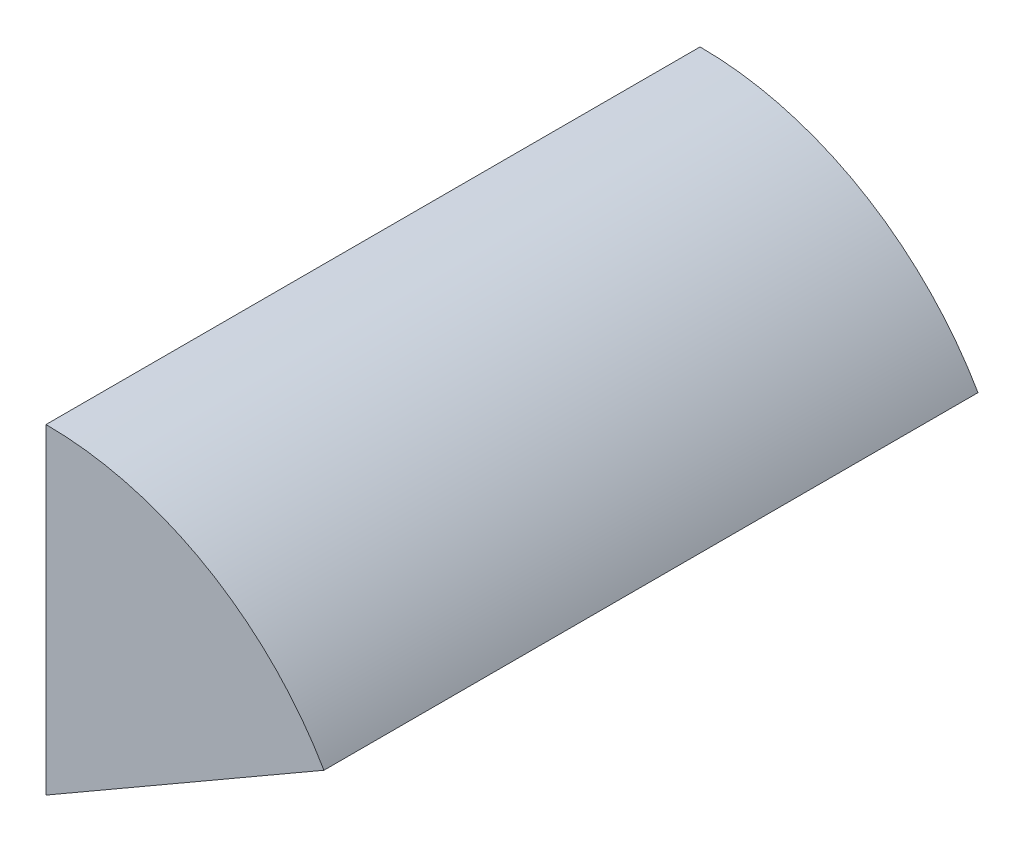
ISO-10303-21;
HEADER;
FILE_DESCRIPTION(('STEP AP214'),'2;1');
FILE_NAME('part.step','',(''),(''),'','','');
FILE_SCHEMA(('AUTOMOTIVE_DESIGN { 1 0 10303 214 1 1 1 1 }'));
ENDSEC;
DATA;
#1=APPLICATION_CONTEXT('core data for automotive mechanical design processes');
#2=APPLICATION_PROTOCOL_DEFINITION('international standard','automotive_design',2000,#1);
#3=PRODUCT_CONTEXT('',#1,'mechanical');
#4=PRODUCT('Part','Part','',(#3));
#5=PRODUCT_RELATED_PRODUCT_CATEGORY('part','',(#4));
#6=PRODUCT_DEFINITION_FORMATION('','',#4);
#7=PRODUCT_DEFINITION_CONTEXT('part definition',#1,'design');
#8=PRODUCT_DEFINITION('design','',#6,#7);
#9=PRODUCT_DEFINITION_SHAPE('','',#8);
#10=(LENGTH_UNIT() NAMED_UNIT(*) SI_UNIT(.MILLI.,.METRE.));
#11=(NAMED_UNIT(*) PLANE_ANGLE_UNIT() SI_UNIT($,.RADIAN.));
#12=(NAMED_UNIT(*) SI_UNIT($,.STERADIAN.) SOLID_ANGLE_UNIT());
#13=UNCERTAINTY_MEASURE_WITH_UNIT(LENGTH_MEASURE(1.E-05),#10,'distance_accuracy_value','');
#14=(GEOMETRIC_REPRESENTATION_CONTEXT(3) GLOBAL_UNCERTAINTY_ASSIGNED_CONTEXT((#13)) GLOBAL_UNIT_ASSIGNED_CONTEXT((#10,
#11,#12)) REPRESENTATION_CONTEXT('',''));
#15=CARTESIAN_POINT('',(0.,0.,0.));
#16=DIRECTION('',(0.,0.,1.));
#17=DIRECTION('',(1.,0.,0.));
#18=AXIS2_PLACEMENT_3D('',#15,#16,#17);
#19=CARTESIAN_POINT('',(0.,0.,50.));
#20=DIRECTION('',(-0.500000000000004,0.866025403784436,0.));
#21=DIRECTION('',(-0.866025403784436,-0.500000000000004,0.));
#22=AXIS2_PLACEMENT_3D('',#19,#20,#21);
#23=PLANE('',#22);
#24=DIRECTION('',(0.866025403784436,0.500000000000004,0.));
#25=VECTOR('',#24,1.);
#26=CARTESIAN_POINT('',(0.,0.,0.));
#27=LINE('',#26,#25);
#28=CARTESIAN_POINT('',(0.,0.,0.));
#29=VERTEX_POINT('',#28);
#30=CARTESIAN_POINT('',(21.2458082850847,12.266273132545,0.));
#31=VERTEX_POINT('',#30);
#32=EDGE_CURVE('E80',#29,#31,#27,.T.);
#33=ORIENTED_EDGE('',*,*,#32,.T.);
#34=DIRECTION('',(0.,0.,-1.));
#35=VECTOR('',#34,1.);
#36=CARTESIAN_POINT('',(21.2458082850847,12.266273132545,50.));
#37=LINE('',#36,#35);
#38=CARTESIAN_POINT('',(21.2458082850847,12.266273132545,50.));
#39=VERTEX_POINT('',#38);
#40=EDGE_CURVE('E11',#39,#31,#37,.T.);
#41=ORIENTED_EDGE('',*,*,#40,.F.);
#42=DIRECTION('',(0.866025403784436,0.500000000000004,0.));
#43=VECTOR('',#42,1.);
#44=CARTESIAN_POINT('',(0.,0.,50.));
#45=LINE('',#44,#43);
#46=CARTESIAN_POINT('',(0.,0.,50.));
#47=VERTEX_POINT('',#46);
#48=EDGE_CURVE('E73',#47,#39,#45,.T.);
#49=ORIENTED_EDGE('',*,*,#48,.F.);
#50=DIRECTION('',(0.,0.,-1.));
#51=VECTOR('',#50,1.);
#52=CARTESIAN_POINT('',(0.,0.,50.));
#53=LINE('',#52,#51);
#54=EDGE_CURVE('E81',#47,#29,#53,.T.);
#55=ORIENTED_EDGE('',*,*,#54,.T.);
#56=EDGE_LOOP('',(#33,#41,#49,#55));
#57=FACE_BOUND('',#56,.T.);
#58=ADVANCED_FACE('F33',(#57),#23,.F.);
#59=CARTESIAN_POINT('',(0.,0.,50.));
#60=DIRECTION('',(0.,0.,-1.));
#61=DIRECTION('',(-1.,0.,0.));
#62=AXIS2_PLACEMENT_3D('',#59,#60,#61);
#63=CYLINDRICAL_SURFACE('',#62,24.5325462650897);
#64=CARTESIAN_POINT('',(0.,0.,0.));
#65=DIRECTION('',(0.,0.,1.));
#66=DIRECTION('',(1.,0.,0.));
#67=AXIS2_PLACEMENT_3D('',#64,#65,#66);
#68=CIRCLE('',#67,24.5325462650897);
#69=CARTESIAN_POINT('',(0.,24.5325462650897,0.));
#70=VERTEX_POINT('',#69);
#71=EDGE_CURVE('E61',#31,#70,#68,.T.);
#72=ORIENTED_EDGE('',*,*,#71,.T.);
#73=DIRECTION('',(0.,0.,-1.));
#74=VECTOR('',#73,1.);
#75=CARTESIAN_POINT('',(0.,24.5325462650897,50.));
#76=LINE('',#75,#74);
#77=CARTESIAN_POINT('',(0.,24.5325462650897,50.));
#78=VERTEX_POINT('',#77);
#79=EDGE_CURVE('E41',#78,#70,#76,.T.);
#80=ORIENTED_EDGE('',*,*,#79,.F.);
#81=CARTESIAN_POINT('',(0.,0.,50.));
#82=DIRECTION('',(0.,0.,1.));
#83=DIRECTION('',(1.,0.,0.));
#84=AXIS2_PLACEMENT_3D('',#81,#82,#83);
#85=CIRCLE('',#84,24.5325462650897);
#86=EDGE_CURVE('E69',#39,#78,#85,.T.);
#87=ORIENTED_EDGE('',*,*,#86,.F.);
#88=ORIENTED_EDGE('',*,*,#40,.T.);
#89=EDGE_LOOP('',(#72,#80,#87,#88));
#90=FACE_BOUND('',#89,.T.);
#91=ADVANCED_FACE('F70',(#90),#63,.T.);
#92=CARTESIAN_POINT('',(0.,24.5325462650897,50.));
#93=DIRECTION('',(1.,0.,0.));
#94=DIRECTION('',(0.,0.,-1.));
#95=AXIS2_PLACEMENT_3D('',#92,#93,#94);
#96=PLANE('',#95);
#97=DIRECTION('',(0.,-1.,0.));
#98=VECTOR('',#97,1.);
#99=CARTESIAN_POINT('',(0.,24.5325462650897,0.));
#100=LINE('',#99,#98);
#101=EDGE_CURVE('E66',#70,#29,#100,.T.);
#102=ORIENTED_EDGE('',*,*,#101,.T.);
#103=ORIENTED_EDGE('',*,*,#54,.F.);
#104=DIRECTION('',(0.,-1.,0.));
#105=VECTOR('',#104,1.);
#106=CARTESIAN_POINT('',(0.,24.5325462650897,50.));
#107=LINE('',#106,#105);
#108=EDGE_CURVE('E49',#78,#47,#107,.T.);
#109=ORIENTED_EDGE('',*,*,#108,.F.);
#110=ORIENTED_EDGE('',*,*,#79,.T.);
#111=EDGE_LOOP('',(#102,#103,#109,#110));
#112=FACE_BOUND('',#111,.T.);
#113=ADVANCED_FACE('F92',(#112),#96,.F.);
#114=CARTESIAN_POINT('',(0.,0.,50.));
#115=DIRECTION('',(0.,0.,1.));
#116=DIRECTION('',(1.,0.,0.));
#117=AXIS2_PLACEMENT_3D('',#114,#115,#116);
#118=PLANE('',#117);
#119=ORIENTED_EDGE('',*,*,#48,.T.);
#120=ORIENTED_EDGE('',*,*,#86,.T.);
#121=ORIENTED_EDGE('',*,*,#108,.T.);
#122=EDGE_LOOP('',(#119,#120,#121));
#123=FACE_BOUND('',#122,.T.);
#124=ADVANCED_FACE('F76',(#123),#118,.T.);
#125=CARTESIAN_POINT('',(0.,0.,0.));
#126=DIRECTION('',(0.,0.,1.));
#127=DIRECTION('',(1.,0.,0.));
#128=AXIS2_PLACEMENT_3D('',#125,#126,#127);
#129=PLANE('',#128);
#130=CARTESIAN_POINT('',(7.5627289489856,13.2928298006277,0.));
#131=DIRECTION('',(0.,0.,-1.));
#132=DIRECTION('',(-1.,0.,0.));
#133=AXIS2_PLACEMENT_3D('',#130,#131,#132);
#134=CIRCLE('',#133,5.);
#135=CARTESIAN_POINT('',(2.5627289489856,13.2928298006277,0.));
#136=VERTEX_POINT('',#135);
#137=EDGE_CURVE('E87',#136,#136,#134,.T.);
#138=ORIENTED_EDGE('',*,*,#137,.F.);
#139=EDGE_LOOP('',(#138));
#140=FACE_BOUND('',#139,.T.);
#141=ORIENTED_EDGE('',*,*,#32,.F.);
#142=ORIENTED_EDGE('',*,*,#101,.F.);
#143=ORIENTED_EDGE('',*,*,#71,.F.);
#144=EDGE_LOOP('',(#141,#142,#143));
#145=FACE_BOUND('',#144,.T.);
#146=ADVANCED_FACE('F93',(#140,#145),#129,.F.);
#147=CARTESIAN_POINT('',(7.5627289489856,13.2928298006277,10.));
#148=DIRECTION('',(0.,0.,-1.));
#149=DIRECTION('',(-1.,0.,0.));
#150=AXIS2_PLACEMENT_3D('',#147,#148,#149);
#151=CYLINDRICAL_SURFACE('',#150,5.);
#152=CARTESIAN_POINT('',(7.5627289489856,13.2928298006277,10.));
#153=DIRECTION('',(0.,0.,-1.));
#154=DIRECTION('',(-1.,0.,0.));
#155=AXIS2_PLACEMENT_3D('',#152,#153,#154);
#156=CIRCLE('',#155,5.);
#157=CARTESIAN_POINT('',(2.5627289489856,13.2928298006277,10.));
#158=VERTEX_POINT('',#157);
#159=EDGE_CURVE('E83',#158,#158,#156,.T.);
#160=ORIENTED_EDGE('',*,*,#159,.F.);
#161=EDGE_LOOP('',(#160));
#162=FACE_BOUND('',#161,.T.);
#163=ORIENTED_EDGE('',*,*,#137,.T.);
#164=EDGE_LOOP('',(#163));
#165=FACE_BOUND('',#164,.T.);
#166=ADVANCED_FACE('F95',(#162,#165),#151,.F.);
#167=CARTESIAN_POINT('',(7.5627289489856,13.2928298006277,10.));
#168=DIRECTION('',(0.,0.,-1.));
#169=DIRECTION('',(-1.,0.,0.));
#170=AXIS2_PLACEMENT_3D('',#167,#168,#169);
#171=PLANE('',#170);
#172=ORIENTED_EDGE('',*,*,#159,.T.);
#173=EDGE_LOOP('',(#172));
#174=FACE_BOUND('',#173,.T.);
#175=ADVANCED_FACE('F102',(#174),#171,.T.);
#176=CLOSED_SHELL('',(#58,#91,#113,#124,#146,#166,#175));
#177=MANIFOLD_SOLID_BREP('B2',#176);
#178=ADVANCED_BREP_SHAPE_REPRESENTATION('',(#18,#177),#14);
#179=SHAPE_DEFINITION_REPRESENTATION(#9,#178);
ENDSEC;
END-ISO-10303-21;
